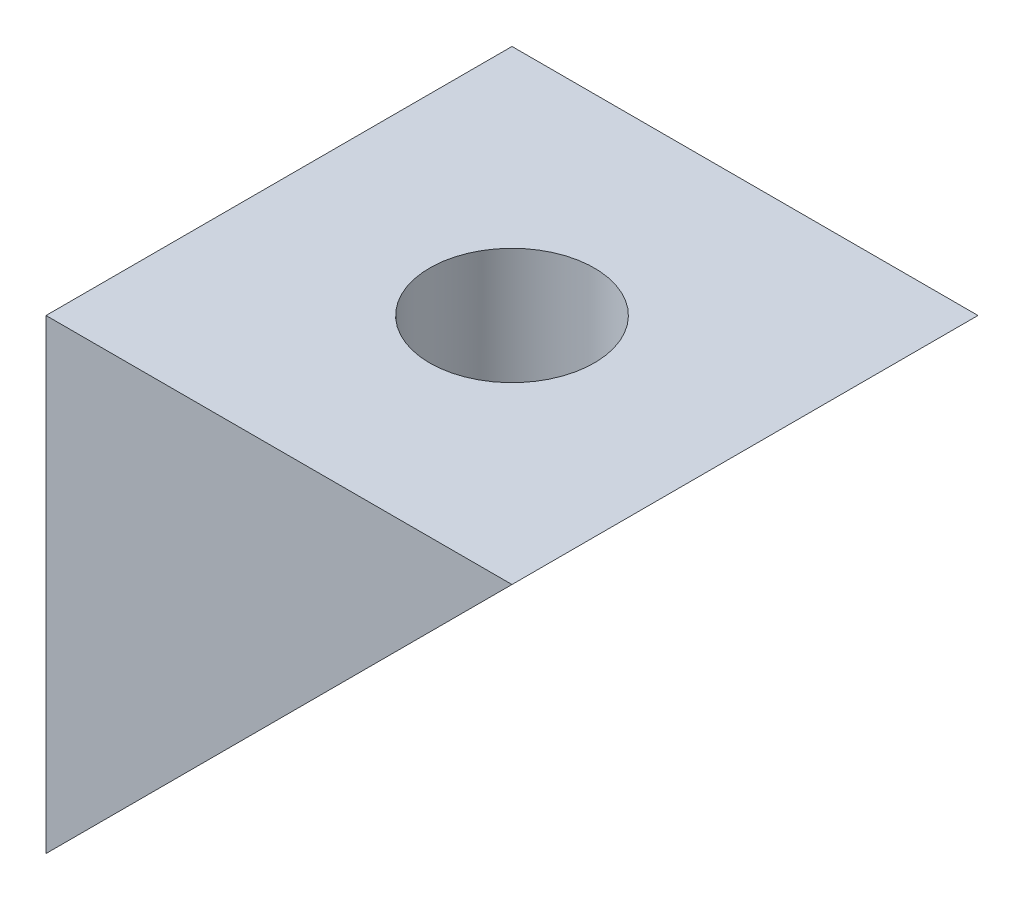
ISO-10303-21;
HEADER;
FILE_DESCRIPTION(('STEP AP214'),'2;1');
FILE_NAME('part.step','',(''),(''),'','','');
FILE_SCHEMA(('AUTOMOTIVE_DESIGN { 1 0 10303 214 1 1 1 1 }'));
ENDSEC;
DATA;
#1=APPLICATION_CONTEXT('core data for automotive mechanical design processes');
#2=APPLICATION_PROTOCOL_DEFINITION('international standard','automotive_design',2000,#1);
#3=PRODUCT_CONTEXT('',#1,'mechanical');
#4=PRODUCT('Part','Part','',(#3));
#5=PRODUCT_RELATED_PRODUCT_CATEGORY('part','',(#4));
#6=PRODUCT_DEFINITION_FORMATION('','',#4);
#7=PRODUCT_DEFINITION_CONTEXT('part definition',#1,'design');
#8=PRODUCT_DEFINITION('design','',#6,#7);
#9=PRODUCT_DEFINITION_SHAPE('','',#8);
#10=(LENGTH_UNIT() NAMED_UNIT(*) SI_UNIT(.MILLI.,.METRE.));
#11=(NAMED_UNIT(*) PLANE_ANGLE_UNIT() SI_UNIT($,.RADIAN.));
#12=(NAMED_UNIT(*) SI_UNIT($,.STERADIAN.) SOLID_ANGLE_UNIT());
#13=UNCERTAINTY_MEASURE_WITH_UNIT(LENGTH_MEASURE(1.E-05),#10,'distance_accuracy_value','');
#14=(GEOMETRIC_REPRESENTATION_CONTEXT(3) GLOBAL_UNCERTAINTY_ASSIGNED_CONTEXT((#13)) GLOBAL_UNIT_ASSIGNED_CONTEXT((#10,
#11,#12)) REPRESENTATION_CONTEXT('',''));
#15=CARTESIAN_POINT('',(0.,0.,0.));
#16=DIRECTION('',(0.,0.,1.));
#17=DIRECTION('',(1.,0.,0.));
#18=AXIS2_PLACEMENT_3D('',#15,#16,#17);
#19=CARTESIAN_POINT('',(12.,12.,12.));
#20=DIRECTION('',(-0.707106781186548,0.707106781186548,0.));
#21=DIRECTION('',(-0.707106781186548,-0.707106781186548,0.));
#22=AXIS2_PLACEMENT_3D('',#19,#20,#21);
#23=PLANE('',#22);
#24=CARTESIAN_POINT('',(6.,6.,6.));
#25=DIRECTION('',(-0.707106781186548,0.707106781186548,0.));
#26=DIRECTION('',(0.707106781186548,0.707106781186548,0.));
#27=AXIS2_PLACEMENT_3D('',#24,#25,#26);
#28=ELLIPSE('',#27,2.99813275223096,2.12);
#29=CARTESIAN_POINT('',(6.,6.,3.88));
#30=VERTEX_POINT('',#29);
#31=CARTESIAN_POINT('',(6.,6.,8.12));
#32=VERTEX_POINT('',#31);
#33=EDGE_CURVE('E46',#30,#32,#28,.T.);
#34=ORIENTED_EDGE('',*,*,#33,.T.);
#35=EDGE_CURVE('E83',#32,#30,#28,.T.);
#36=ORIENTED_EDGE('',*,*,#35,.T.);
#37=EDGE_LOOP('',(#34,#36));
#38=FACE_BOUND('',#37,.T.);
#39=DIRECTION('',(0.707106781186547,0.707106781186547,0.));
#40=VECTOR('',#39,1.);
#41=CARTESIAN_POINT('',(12.,12.,0.));
#42=LINE('',#41,#40);
#43=CARTESIAN_POINT('',(0.,0.,0.));
#44=VERTEX_POINT('',#43);
#45=CARTESIAN_POINT('',(12.,12.,0.));
#46=VERTEX_POINT('',#45);
#47=EDGE_CURVE('E89',#44,#46,#42,.T.);
#48=ORIENTED_EDGE('',*,*,#47,.T.);
#49=DIRECTION('',(0.,0.,-1.));
#50=VECTOR('',#49,1.);
#51=CARTESIAN_POINT('',(12.,12.,12.));
#52=LINE('',#51,#50);
#53=CARTESIAN_POINT('',(12.,12.,12.));
#54=VERTEX_POINT('',#53);
#55=EDGE_CURVE('E40',#54,#46,#52,.T.);
#56=ORIENTED_EDGE('',*,*,#55,.F.);
#57=DIRECTION('',(0.707106781186547,0.707106781186547,0.));
#58=VECTOR('',#57,1.);
#59=CARTESIAN_POINT('',(12.,12.,12.));
#60=LINE('',#59,#58);
#61=CARTESIAN_POINT('',(0.,0.,12.));
#62=VERTEX_POINT('',#61);
#63=EDGE_CURVE('E96',#62,#54,#60,.T.);
#64=ORIENTED_EDGE('',*,*,#63,.F.);
#65=DIRECTION('',(0.,0.,-1.));
#66=VECTOR('',#65,1.);
#67=CARTESIAN_POINT('',(0.,0.,12.));
#68=LINE('',#67,#66);
#69=EDGE_CURVE('E99',#62,#44,#68,.T.);
#70=ORIENTED_EDGE('',*,*,#69,.T.);
#71=EDGE_LOOP('',(#48,#56,#64,#70));
#72=FACE_BOUND('',#71,.T.);
#73=ADVANCED_FACE('F33',(#38,#72),#23,.F.);
#74=CARTESIAN_POINT('',(0.,12.,12.));
#75=DIRECTION('',(0.,-1.,0.));
#76=DIRECTION('',(0.,0.,-1.));
#77=AXIS2_PLACEMENT_3D('',#74,#75,#76);
#78=PLANE('',#77);
#79=CARTESIAN_POINT('',(6.,12.,6.));
#80=DIRECTION('',(0.,1.,0.));
#81=DIRECTION('',(0.,0.,1.));
#82=AXIS2_PLACEMENT_3D('',#79,#80,#81);
#83=CIRCLE('',#82,2.12);
#84=CARTESIAN_POINT('',(6.,12.,8.12));
#85=VERTEX_POINT('',#84);
#86=EDGE_CURVE('E86',#85,#85,#83,.T.);
#87=ORIENTED_EDGE('',*,*,#86,.F.);
#88=EDGE_LOOP('',(#87));
#89=FACE_BOUND('',#88,.T.);
#90=DIRECTION('',(-1.,0.,0.));
#91=VECTOR('',#90,1.);
#92=CARTESIAN_POINT('',(0.,12.,0.));
#93=LINE('',#92,#91);
#94=CARTESIAN_POINT('',(0.,12.,0.));
#95=VERTEX_POINT('',#94);
#96=EDGE_CURVE('E91',#46,#95,#93,.T.);
#97=ORIENTED_EDGE('',*,*,#96,.T.);
#98=DIRECTION('',(0.,0.,-1.));
#99=VECTOR('',#98,1.);
#100=CARTESIAN_POINT('',(0.,12.,12.));
#101=LINE('',#100,#99);
#102=CARTESIAN_POINT('',(0.,12.,12.));
#103=VERTEX_POINT('',#102);
#104=EDGE_CURVE('E104',#103,#95,#101,.T.);
#105=ORIENTED_EDGE('',*,*,#104,.F.);
#106=DIRECTION('',(-1.,0.,0.));
#107=VECTOR('',#106,1.);
#108=CARTESIAN_POINT('',(0.,12.,12.));
#109=LINE('',#108,#107);
#110=EDGE_CURVE('E77',#54,#103,#109,.T.);
#111=ORIENTED_EDGE('',*,*,#110,.F.);
#112=ORIENTED_EDGE('',*,*,#55,.T.);
#113=EDGE_LOOP('',(#97,#105,#111,#112));
#114=FACE_BOUND('',#113,.T.);
#115=ADVANCED_FACE('F106',(#89,#114),#78,.F.);
#116=CARTESIAN_POINT('',(0.,0.,12.));
#117=DIRECTION('',(1.,0.,0.));
#118=DIRECTION('',(0.,0.,-1.));
#119=AXIS2_PLACEMENT_3D('',#116,#117,#118);
#120=PLANE('',#119);
#121=CARTESIAN_POINT('',(0.,6.,6.));
#122=DIRECTION('',(-1.,0.,0.));
#123=DIRECTION('',(0.,0.,1.));
#124=AXIS2_PLACEMENT_3D('',#121,#122,#123);
#125=CIRCLE('',#124,2.12);
#126=CARTESIAN_POINT('',(0.,6.,8.12));
#127=VERTEX_POINT('',#126);
#128=EDGE_CURVE('E134',#127,#127,#125,.T.);
#129=ORIENTED_EDGE('',*,*,#128,.F.);
#130=EDGE_LOOP('',(#129));
#131=FACE_BOUND('',#130,.T.);
#132=DIRECTION('',(0.,-1.,0.));
#133=VECTOR('',#132,1.);
#134=CARTESIAN_POINT('',(0.,0.,0.));
#135=LINE('',#134,#133);
#136=EDGE_CURVE('E71',#95,#44,#135,.T.);
#137=ORIENTED_EDGE('',*,*,#136,.T.);
#138=ORIENTED_EDGE('',*,*,#69,.F.);
#139=DIRECTION('',(0.,-1.,0.));
#140=VECTOR('',#139,1.);
#141=CARTESIAN_POINT('',(0.,0.,12.));
#142=LINE('',#141,#140);
#143=EDGE_CURVE('E54',#103,#62,#142,.T.);
#144=ORIENTED_EDGE('',*,*,#143,.F.);
#145=ORIENTED_EDGE('',*,*,#104,.T.);
#146=EDGE_LOOP('',(#137,#138,#144,#145));
#147=FACE_BOUND('',#146,.T.);
#148=ADVANCED_FACE('F120',(#131,#147),#120,.F.);
#149=CARTESIAN_POINT('',(0.,0.,12.));
#150=DIRECTION('',(0.,0.,-1.));
#151=DIRECTION('',(-1.,0.,0.));
#152=AXIS2_PLACEMENT_3D('',#149,#150,#151);
#153=PLANE('',#152);
#154=ORIENTED_EDGE('',*,*,#63,.T.);
#155=ORIENTED_EDGE('',*,*,#110,.T.);
#156=ORIENTED_EDGE('',*,*,#143,.T.);
#157=EDGE_LOOP('',(#154,#155,#156));
#158=FACE_BOUND('',#157,.T.);
#159=ADVANCED_FACE('F112',(#158),#153,.F.);
#160=CARTESIAN_POINT('',(0.,0.,0.));
#161=DIRECTION('',(0.,0.,-1.));
#162=DIRECTION('',(-1.,0.,0.));
#163=AXIS2_PLACEMENT_3D('',#160,#161,#162);
#164=PLANE('',#163);
#165=ORIENTED_EDGE('',*,*,#47,.F.);
#166=ORIENTED_EDGE('',*,*,#136,.F.);
#167=ORIENTED_EDGE('',*,*,#96,.F.);
#168=EDGE_LOOP('',(#165,#166,#167));
#169=FACE_BOUND('',#168,.T.);
#170=ADVANCED_FACE('F110',(#169),#164,.T.);
#171=CARTESIAN_POINT('',(6.,0.,6.));
#172=DIRECTION('',(0.,1.,0.));
#173=DIRECTION('',(0.,0.,1.));
#174=AXIS2_PLACEMENT_3D('',#171,#172,#173);
#175=CYLINDRICAL_SURFACE('',#174,2.12);
#176=ORIENTED_EDGE('',*,*,#86,.T.);
#177=EDGE_LOOP('',(#176));
#178=FACE_BOUND('',#177,.T.);
#179=ORIENTED_EDGE('',*,*,#35,.F.);
#180=CARTESIAN_POINT('',(6.,6.,6.));
#181=DIRECTION('',(0.707106781186547,0.707106781186547,0.));
#182=DIRECTION('',(-0.707106781186547,0.707106781186547,0.));
#183=AXIS2_PLACEMENT_3D('',#180,#181,#182);
#184=ELLIPSE('',#183,2.99813275223096,2.12);
#185=EDGE_CURVE('E11',#32,#30,#184,.F.);
#186=ORIENTED_EDGE('',*,*,#185,.T.);
#187=EDGE_LOOP('',(#179,#186));
#188=FACE_BOUND('',#187,.T.);
#189=ADVANCED_FACE('F84',(#178,#188),#175,.F.);
#190=CARTESIAN_POINT('',(12.,6.,6.));
#191=DIRECTION('',(-1.,0.,0.));
#192=DIRECTION('',(0.,0.,1.));
#193=AXIS2_PLACEMENT_3D('',#190,#191,#192);
#194=CYLINDRICAL_SURFACE('',#193,2.12);
#195=ORIENTED_EDGE('',*,*,#128,.T.);
#196=EDGE_LOOP('',(#195));
#197=FACE_BOUND('',#196,.T.);
#198=ORIENTED_EDGE('',*,*,#185,.F.);
#199=ORIENTED_EDGE('',*,*,#33,.F.);
#200=EDGE_LOOP('',(#198,#199));
#201=FACE_BOUND('',#200,.T.);
#202=ADVANCED_FACE('F80',(#197,#201),#194,.F.);
#203=CLOSED_SHELL('',(#73,#115,#148,#159,#170,#189,#202));
#204=MANIFOLD_SOLID_BREP('B2',#203);
#205=ADVANCED_BREP_SHAPE_REPRESENTATION('',(#18,#204),#14);
#206=SHAPE_DEFINITION_REPRESENTATION(#9,#205);
ENDSEC;
END-ISO-10303-21;
